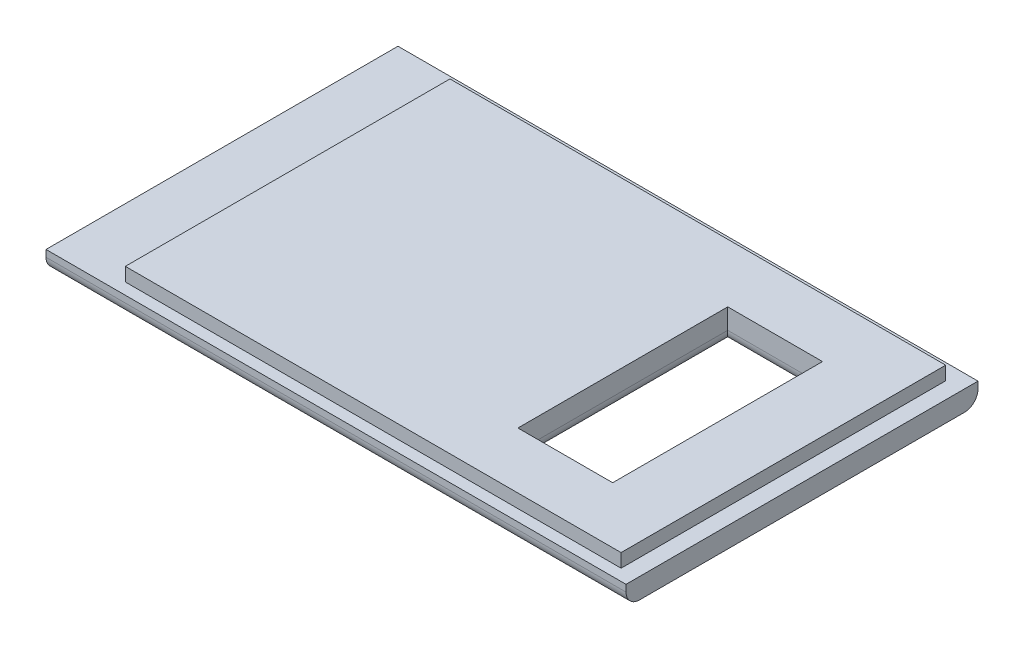
ISO-10303-21;
HEADER;
FILE_DESCRIPTION(('STEP AP214'),'2;1');
FILE_NAME('part.step','',(''),(''),'','','');
FILE_SCHEMA(('AUTOMOTIVE_DESIGN { 1 0 10303 214 1 1 1 1 }'));
ENDSEC;
DATA;
#1=APPLICATION_CONTEXT('core data for automotive mechanical design processes');
#2=APPLICATION_PROTOCOL_DEFINITION('international standard','automotive_design',2000,#1);
#3=PRODUCT_CONTEXT('',#1,'mechanical');
#4=PRODUCT('Part','Part','',(#3));
#5=PRODUCT_RELATED_PRODUCT_CATEGORY('part','',(#4));
#6=PRODUCT_DEFINITION_FORMATION('','',#4);
#7=PRODUCT_DEFINITION_CONTEXT('part definition',#1,'design');
#8=PRODUCT_DEFINITION('design','',#6,#7);
#9=PRODUCT_DEFINITION_SHAPE('','',#8);
#10=(LENGTH_UNIT() NAMED_UNIT(*) SI_UNIT(.MILLI.,.METRE.));
#11=(NAMED_UNIT(*) PLANE_ANGLE_UNIT() SI_UNIT($,.RADIAN.));
#12=(NAMED_UNIT(*) SI_UNIT($,.STERADIAN.) SOLID_ANGLE_UNIT());
#13=UNCERTAINTY_MEASURE_WITH_UNIT(LENGTH_MEASURE(1.E-05),#10,'distance_accuracy_value','');
#14=(GEOMETRIC_REPRESENTATION_CONTEXT(3) GLOBAL_UNCERTAINTY_ASSIGNED_CONTEXT((#13)) GLOBAL_UNIT_ASSIGNED_CONTEXT((#10,
#11,#12)) REPRESENTATION_CONTEXT('',''));
#15=CARTESIAN_POINT('',(0.,0.,0.));
#16=DIRECTION('',(0.,0.,1.));
#17=DIRECTION('',(1.,0.,0.));
#18=AXIS2_PLACEMENT_3D('',#15,#16,#17);
#19=CARTESIAN_POINT('',(0.,0.,0.));
#20=DIRECTION('',(0.,1.,0.));
#21=DIRECTION('',(0.,0.,1.));
#22=AXIS2_PLACEMENT_3D('',#19,#20,#21);
#23=PLANE('',#22);
#24=DIRECTION('',(0.,0.,1.));
#25=VECTOR('',#24,1.);
#26=CARTESIAN_POINT('',(53.6198539965798,0.,-32.2923627781718));
#27=LINE('',#26,#25);
#28=CARTESIAN_POINT('',(53.6198539965798,0.,9.61763722182825));
#29=VERTEX_POINT('',#28);
#30=CARTESIAN_POINT('',(53.6198539965798,0.,-34.8323627781718));
#31=VERTEX_POINT('',#30);
#32=EDGE_CURVE('E306',#29,#31,#27,.F.);
#33=ORIENTED_EDGE('',*,*,#32,.T.);
#34=DIRECTION('',(1.,0.,0.));
#35=VECTOR('',#34,1.);
#36=CARTESIAN_POINT('',(33.2998539965798,0.,-34.8323627781718));
#37=LINE('',#36,#35);
#38=CARTESIAN_POINT('',(30.7598539965798,0.,-34.8323627781718));
#39=VERTEX_POINT('',#38);
#40=EDGE_CURVE('E315',#31,#39,#37,.F.);
#41=ORIENTED_EDGE('',*,*,#40,.T.);
#42=DIRECTION('',(0.,0.,1.));
#43=VECTOR('',#42,1.);
#44=CARTESIAN_POINT('',(30.7598539965798,0.,0.));
#45=LINE('',#44,#43);
#46=CARTESIAN_POINT('',(30.7598539965798,0.,9.61763722182825));
#47=VERTEX_POINT('',#46);
#48=EDGE_CURVE('E312',#39,#47,#45,.T.);
#49=ORIENTED_EDGE('',*,*,#48,.T.);
#50=DIRECTION('',(1.,0.,0.));
#51=VECTOR('',#50,1.);
#52=CARTESIAN_POINT('',(0.,0.,9.61763722182825));
#53=LINE('',#52,#51);
#54=EDGE_CURVE('E309',#47,#29,#53,.T.);
#55=ORIENTED_EDGE('',*,*,#54,.T.);
#56=EDGE_LOOP('',(#33,#41,#49,#55));
#57=FACE_BOUND('',#56,.T.);
#58=DIRECTION('',(0.,0.,1.));
#59=VECTOR('',#58,1.);
#60=CARTESIAN_POINT('',(-42.5250491079234,0.,-46.2471717968124));
#61=LINE('',#60,#59);
#62=CARTESIAN_POINT('',(-42.5250491079234,0.,-43.7071717968124));
#63=VERTEX_POINT('',#62);
#64=CARTESIAN_POINT('',(-42.5250491079234,0.,17.2528282031876));
#65=VERTEX_POINT('',#64);
#66=EDGE_CURVE('E239',#63,#65,#61,.T.);
#67=ORIENTED_EDGE('',*,*,#66,.F.);
#68=DIRECTION('',(1.,0.,0.));
#69=VECTOR('',#68,1.);
#70=CARTESIAN_POINT('',(66.2990539113766,0.,-43.7071717968124));
#71=LINE('',#70,#69);
#72=CARTESIAN_POINT('',(66.2990539113766,0.,-43.7071717968124));
#73=VERTEX_POINT('',#72);
#74=EDGE_CURVE('E281',#63,#73,#71,.T.);
#75=ORIENTED_EDGE('',*,*,#74,.T.);
#76=DIRECTION('',(0.,0.,1.));
#77=VECTOR('',#76,1.);
#78=CARTESIAN_POINT('',(66.2990539113766,0.,-46.2471717968124));
#79=LINE('',#78,#77);
#80=CARTESIAN_POINT('',(66.2990539113766,0.,17.2528282031876));
#81=VERTEX_POINT('',#80);
#82=EDGE_CURVE('E245',#73,#81,#79,.T.);
#83=ORIENTED_EDGE('',*,*,#82,.T.);
#84=DIRECTION('',(1.,0.,0.));
#85=VECTOR('',#84,1.);
#86=CARTESIAN_POINT('',(0.,0.,17.2528282031876));
#87=LINE('',#86,#85);
#88=EDGE_CURVE('E278',#81,#65,#87,.F.);
#89=ORIENTED_EDGE('',*,*,#88,.T.);
#90=EDGE_LOOP('',(#67,#75,#83,#89));
#91=FACE_BOUND('',#90,.T.);
#92=ADVANCED_FACE('F38',(#57,#91),#23,.F.);
#93=CARTESIAN_POINT('',(0.,6.35,0.));
#94=DIRECTION('',(0.,1.,0.));
#95=DIRECTION('',(0.,0.,1.));
#96=AXIS2_PLACEMENT_3D('',#93,#94,#95);
#97=PLANE('',#96);
#98=DIRECTION('',(0.,0.,1.));
#99=VECTOR('',#98,1.);
#100=CARTESIAN_POINT('',(-29.7959261422426,6.35,-43.2705988826325));
#101=LINE('',#100,#99);
#102=CARTESIAN_POINT('',(-29.7959261422426,6.35,-43.2705988826325));
#103=VERTEX_POINT('',#102);
#104=CARTESIAN_POINT('',(-29.7959261422426,6.35,17.6386011173675));
#105=VERTEX_POINT('',#104);
#106=EDGE_CURVE('E195',#103,#105,#101,.T.);
#107=ORIENTED_EDGE('',*,*,#106,.T.);
#108=DIRECTION('',(1.,0.,0.));
#109=VECTOR('',#108,1.);
#110=CARTESIAN_POINT('',(-29.7959261422426,6.35,17.6386011173675));
#111=LINE('',#110,#109);
#112=CARTESIAN_POINT('',(63.2188738577574,6.35,17.6386011173675));
#113=VERTEX_POINT('',#112);
#114=EDGE_CURVE('E199',#105,#113,#111,.T.);
#115=ORIENTED_EDGE('',*,*,#114,.T.);
#116=DIRECTION('',(0.,0.,1.));
#117=VECTOR('',#116,1.);
#118=CARTESIAN_POINT('',(63.2188738577574,6.35,-43.2705988826325));
#119=LINE('',#118,#117);
#120=CARTESIAN_POINT('',(63.2188738577574,6.35,-43.2705988826325));
#121=VERTEX_POINT('',#120);
#122=EDGE_CURVE('E203',#121,#113,#119,.T.);
#123=ORIENTED_EDGE('',*,*,#122,.F.);
#124=DIRECTION('',(1.,0.,0.));
#125=VECTOR('',#124,1.);
#126=CARTESIAN_POINT('',(-29.7959261422426,6.35,-43.2705988826325));
#127=LINE('',#126,#125);
#128=EDGE_CURVE('E207',#103,#121,#127,.T.);
#129=ORIENTED_EDGE('',*,*,#128,.F.);
#130=EDGE_LOOP('',(#107,#115,#123,#129));
#131=FACE_BOUND('',#130,.T.);
#132=DIRECTION('',(0.,0.,1.));
#133=VECTOR('',#132,1.);
#134=CARTESIAN_POINT('',(33.2998539965798,6.35,-32.2923627781718));
#135=LINE('',#134,#133);
#136=CARTESIAN_POINT('',(33.2998539965798,6.35,-32.2923627781718));
#137=VERTEX_POINT('',#136);
#138=CARTESIAN_POINT('',(33.2998539965798,6.35,7.07763722182825));
#139=VERTEX_POINT('',#138);
#140=EDGE_CURVE('E176',#137,#139,#135,.T.);
#141=ORIENTED_EDGE('',*,*,#140,.F.);
#142=DIRECTION('',(1.,0.,0.));
#143=VECTOR('',#142,1.);
#144=CARTESIAN_POINT('',(33.2998539965798,6.35,-32.2923627781718));
#145=LINE('',#144,#143);
#146=CARTESIAN_POINT('',(51.0798539965798,6.35,-32.2923627781718));
#147=VERTEX_POINT('',#146);
#148=EDGE_CURVE('E157',#137,#147,#145,.T.);
#149=ORIENTED_EDGE('',*,*,#148,.T.);
#150=DIRECTION('',(0.,0.,1.));
#151=VECTOR('',#150,1.);
#152=CARTESIAN_POINT('',(51.0798539965798,6.35,-32.2923627781718));
#153=LINE('',#152,#151);
#154=CARTESIAN_POINT('',(51.0798539965798,6.35,7.07763722182825));
#155=VERTEX_POINT('',#154);
#156=EDGE_CURVE('E166',#147,#155,#153,.T.);
#157=ORIENTED_EDGE('',*,*,#156,.T.);
#158=DIRECTION('',(1.,0.,0.));
#159=VECTOR('',#158,1.);
#160=CARTESIAN_POINT('',(33.2998539965798,6.35,7.07763722182825));
#161=LINE('',#160,#159);
#162=EDGE_CURVE('E172',#139,#155,#161,.T.);
#163=ORIENTED_EDGE('',*,*,#162,.F.);
#164=EDGE_LOOP('',(#141,#149,#157,#163));
#165=FACE_BOUND('',#164,.T.);
#166=ADVANCED_FACE('F174',(#131,#165),#97,.T.);
#167=CARTESIAN_POINT('',(-42.5250491079234,3.81,-46.2471717968124));
#168=DIRECTION('',(1.,0.,0.));
#169=DIRECTION('',(0.,0.,-1.));
#170=AXIS2_PLACEMENT_3D('',#167,#168,#169);
#171=PLANE('',#170);
#172=DIRECTION('',(0.,-1.,0.));
#173=VECTOR('',#172,1.);
#174=CARTESIAN_POINT('',(-42.5250491079234,3.81,-46.2471717968124));
#175=LINE('',#174,#173);
#176=CARTESIAN_POINT('',(-42.5250491079234,3.81,-46.2471717968124));
#177=VERTEX_POINT('',#176);
#178=CARTESIAN_POINT('',(-42.5250491079234,2.54,-46.2471717968124));
#179=VERTEX_POINT('',#178);
#180=EDGE_CURVE('E256',#177,#179,#175,.T.);
#181=ORIENTED_EDGE('',*,*,#180,.T.);
#182=CARTESIAN_POINT('',(-42.5250491079234,2.54,-43.7071717968124));
#183=DIRECTION('',(1.,0.,0.));
#184=DIRECTION('',(0.,0.,-1.));
#185=AXIS2_PLACEMENT_3D('',#182,#183,#184);
#186=CIRCLE('',#185,2.54);
#187=EDGE_CURVE('E297',#179,#63,#186,.F.);
#188=ORIENTED_EDGE('',*,*,#187,.T.);
#189=ORIENTED_EDGE('',*,*,#66,.T.);
#190=CARTESIAN_POINT('',(-42.5250491079234,2.54,17.2528282031876));
#191=DIRECTION('',(1.,0.,0.));
#192=DIRECTION('',(0.,0.,-1.));
#193=AXIS2_PLACEMENT_3D('',#190,#191,#192);
#194=CIRCLE('',#193,2.54);
#195=CARTESIAN_POINT('',(-42.5250491079234,2.54,19.7928282031876));
#196=VERTEX_POINT('',#195);
#197=EDGE_CURVE('E294',#65,#196,#194,.F.);
#198=ORIENTED_EDGE('',*,*,#197,.T.);
#199=DIRECTION('',(0.,-1.,0.));
#200=VECTOR('',#199,1.);
#201=CARTESIAN_POINT('',(-42.5250491079234,3.81,19.7928282031876));
#202=LINE('',#201,#200);
#203=CARTESIAN_POINT('',(-42.5250491079234,3.81,19.7928282031876));
#204=VERTEX_POINT('',#203);
#205=EDGE_CURVE('E274',#204,#196,#202,.T.);
#206=ORIENTED_EDGE('',*,*,#205,.F.);
#207=DIRECTION('',(0.,0.,1.));
#208=VECTOR('',#207,1.);
#209=CARTESIAN_POINT('',(-42.5250491079234,3.81,-46.2471717968124));
#210=LINE('',#209,#208);
#211=EDGE_CURVE('E240',#177,#204,#210,.T.);
#212=ORIENTED_EDGE('',*,*,#211,.F.);
#213=EDGE_LOOP('',(#181,#188,#189,#198,#206,#212));
#214=FACE_BOUND('',#213,.T.);
#215=ADVANCED_FACE('F362',(#214),#171,.F.);
#216=CARTESIAN_POINT('',(-42.5250491079234,3.81,19.7928282031876));
#217=DIRECTION('',(0.,0.,-1.));
#218=DIRECTION('',(-1.,0.,0.));
#219=AXIS2_PLACEMENT_3D('',#216,#217,#218);
#220=PLANE('',#219);
#221=ORIENTED_EDGE('',*,*,#205,.T.);
#222=DIRECTION('',(1.,0.,0.));
#223=VECTOR('',#222,1.);
#224=CARTESIAN_POINT('',(-42.5250491079234,2.54,19.7928282031876));
#225=LINE('',#224,#223);
#226=CARTESIAN_POINT('',(66.2990539113766,2.54,19.7928282031876));
#227=VERTEX_POINT('',#226);
#228=EDGE_CURVE('E300',#196,#227,#225,.T.);
#229=ORIENTED_EDGE('',*,*,#228,.T.);
#230=DIRECTION('',(0.,-1.,0.));
#231=VECTOR('',#230,1.);
#232=CARTESIAN_POINT('',(66.2990539113766,3.81,19.7928282031876));
#233=LINE('',#232,#231);
#234=CARTESIAN_POINT('',(66.2990539113766,3.81,19.7928282031876));
#235=VERTEX_POINT('',#234);
#236=EDGE_CURVE('E270',#235,#227,#233,.T.);
#237=ORIENTED_EDGE('',*,*,#236,.F.);
#238=DIRECTION('',(1.,0.,0.));
#239=VECTOR('',#238,1.);
#240=CARTESIAN_POINT('',(-42.5250491079234,3.81,19.7928282031876));
#241=LINE('',#240,#239);
#242=EDGE_CURVE('E244',#204,#235,#241,.T.);
#243=ORIENTED_EDGE('',*,*,#242,.F.);
#244=EDGE_LOOP('',(#221,#229,#237,#243));
#245=FACE_BOUND('',#244,.T.);
#246=ADVANCED_FACE('F377',(#245),#220,.F.);
#247=CARTESIAN_POINT('',(66.2990539113766,3.81,-46.2471717968124));
#248=DIRECTION('',(1.,0.,0.));
#249=DIRECTION('',(0.,0.,-1.));
#250=AXIS2_PLACEMENT_3D('',#247,#248,#249);
#251=PLANE('',#250);
#252=ORIENTED_EDGE('',*,*,#82,.F.);
#253=CARTESIAN_POINT('',(66.2990539113766,2.54,-43.7071717968124));
#254=DIRECTION('',(1.,0.,0.));
#255=DIRECTION('',(0.,0.,-1.));
#256=AXIS2_PLACEMENT_3D('',#253,#254,#255);
#257=CIRCLE('',#256,2.54);
#258=CARTESIAN_POINT('',(66.2990539113766,2.54,-46.2471717968124));
#259=VERTEX_POINT('',#258);
#260=EDGE_CURVE('E288',#73,#259,#257,.T.);
#261=ORIENTED_EDGE('',*,*,#260,.T.);
#262=DIRECTION('',(0.,-1.,0.));
#263=VECTOR('',#262,1.);
#264=CARTESIAN_POINT('',(66.2990539113766,3.81,-46.2471717968124));
#265=LINE('',#264,#263);
#266=CARTESIAN_POINT('',(66.2990539113766,3.81,-46.2471717968124));
#267=VERTEX_POINT('',#266);
#268=EDGE_CURVE('E266',#267,#259,#265,.T.);
#269=ORIENTED_EDGE('',*,*,#268,.F.);
#270=DIRECTION('',(0.,0.,1.));
#271=VECTOR('',#270,1.);
#272=CARTESIAN_POINT('',(66.2990539113766,3.81,-46.2471717968124));
#273=LINE('',#272,#271);
#274=EDGE_CURVE('E248',#267,#235,#273,.T.);
#275=ORIENTED_EDGE('',*,*,#274,.T.);
#276=ORIENTED_EDGE('',*,*,#236,.T.);
#277=CARTESIAN_POINT('',(66.2990539113766,2.54,17.2528282031876));
#278=DIRECTION('',(1.,0.,0.));
#279=DIRECTION('',(0.,0.,-1.));
#280=AXIS2_PLACEMENT_3D('',#277,#278,#279);
#281=CIRCLE('',#280,2.54);
#282=EDGE_CURVE('E285',#227,#81,#281,.T.);
#283=ORIENTED_EDGE('',*,*,#282,.T.);
#284=EDGE_LOOP('',(#252,#261,#269,#275,#276,#283));
#285=FACE_BOUND('',#284,.T.);
#286=ADVANCED_FACE('F373',(#285),#251,.T.);
#287=CARTESIAN_POINT('',(-42.5250491079234,3.81,-46.2471717968124));
#288=DIRECTION('',(0.,0.,-1.));
#289=DIRECTION('',(-1.,0.,0.));
#290=AXIS2_PLACEMENT_3D('',#287,#288,#289);
#291=PLANE('',#290);
#292=ORIENTED_EDGE('',*,*,#268,.T.);
#293=DIRECTION('',(1.,0.,0.));
#294=VECTOR('',#293,1.);
#295=CARTESIAN_POINT('',(-42.5250491079234,2.54,-46.2471717968124));
#296=LINE('',#295,#294);
#297=EDGE_CURVE('E291',#259,#179,#296,.F.);
#298=ORIENTED_EDGE('',*,*,#297,.T.);
#299=ORIENTED_EDGE('',*,*,#180,.F.);
#300=DIRECTION('',(1.,0.,0.));
#301=VECTOR('',#300,1.);
#302=CARTESIAN_POINT('',(-42.5250491079234,3.81,-46.2471717968124));
#303=LINE('',#302,#301);
#304=EDGE_CURVE('E252',#177,#267,#303,.T.);
#305=ORIENTED_EDGE('',*,*,#304,.T.);
#306=EDGE_LOOP('',(#292,#298,#299,#305));
#307=FACE_BOUND('',#306,.T.);
#308=ADVANCED_FACE('F370',(#307),#291,.T.);
#309=CARTESIAN_POINT('',(0.,3.81,0.));
#310=DIRECTION('',(0.,1.,0.));
#311=DIRECTION('',(0.,0.,1.));
#312=AXIS2_PLACEMENT_3D('',#309,#310,#311);
#313=PLANE('',#312);
#314=DIRECTION('',(0.,0.,1.));
#315=VECTOR('',#314,1.);
#316=CARTESIAN_POINT('',(-29.7959261422426,3.81,-43.2705988826325));
#317=LINE('',#316,#315);
#318=CARTESIAN_POINT('',(-29.7959261422426,3.81,-43.2705988826325));
#319=VERTEX_POINT('',#318);
#320=CARTESIAN_POINT('',(-29.7959261422426,3.81,17.6386011173675));
#321=VERTEX_POINT('',#320);
#322=EDGE_CURVE('E162',#319,#321,#317,.T.);
#323=ORIENTED_EDGE('',*,*,#322,.F.);
#324=DIRECTION('',(1.,0.,0.));
#325=VECTOR('',#324,1.);
#326=CARTESIAN_POINT('',(-29.7959261422426,3.81,-43.2705988826325));
#327=LINE('',#326,#325);
#328=CARTESIAN_POINT('',(63.2188738577574,3.81,-43.2705988826325));
#329=VERTEX_POINT('',#328);
#330=EDGE_CURVE('E200',#319,#329,#327,.T.);
#331=ORIENTED_EDGE('',*,*,#330,.T.);
#332=DIRECTION('',(0.,0.,1.));
#333=VECTOR('',#332,1.);
#334=CARTESIAN_POINT('',(63.2188738577574,3.81,-43.2705988826325));
#335=LINE('',#334,#333);
#336=CARTESIAN_POINT('',(63.2188738577574,3.81,17.6386011173675));
#337=VERTEX_POINT('',#336);
#338=EDGE_CURVE('E219',#329,#337,#335,.T.);
#339=ORIENTED_EDGE('',*,*,#338,.T.);
#340=DIRECTION('',(1.,0.,0.));
#341=VECTOR('',#340,1.);
#342=CARTESIAN_POINT('',(-29.7959261422426,3.81,17.6386011173675));
#343=LINE('',#342,#341);
#344=EDGE_CURVE('E215',#321,#337,#343,.T.);
#345=ORIENTED_EDGE('',*,*,#344,.F.);
#346=EDGE_LOOP('',(#323,#331,#339,#345));
#347=FACE_BOUND('',#346,.T.);
#348=ORIENTED_EDGE('',*,*,#211,.T.);
#349=ORIENTED_EDGE('',*,*,#242,.T.);
#350=ORIENTED_EDGE('',*,*,#274,.F.);
#351=ORIENTED_EDGE('',*,*,#304,.F.);
#352=EDGE_LOOP('',(#348,#349,#350,#351));
#353=FACE_BOUND('',#352,.T.);
#354=ADVANCED_FACE('F368',(#347,#353),#313,.T.);
#355=CARTESIAN_POINT('',(-29.7959261422426,6.35,-43.2705988826325));
#356=DIRECTION('',(1.,0.,0.));
#357=DIRECTION('',(0.,0.,-1.));
#358=AXIS2_PLACEMENT_3D('',#355,#356,#357);
#359=PLANE('',#358);
#360=ORIENTED_EDGE('',*,*,#322,.T.);
#361=DIRECTION('',(0.,-1.,0.));
#362=VECTOR('',#361,1.);
#363=CARTESIAN_POINT('',(-29.7959261422426,6.35,17.6386011173675));
#364=LINE('',#363,#362);
#365=EDGE_CURVE('E235',#105,#321,#364,.T.);
#366=ORIENTED_EDGE('',*,*,#365,.F.);
#367=ORIENTED_EDGE('',*,*,#106,.F.);
#368=DIRECTION('',(0.,-1.,0.));
#369=VECTOR('',#368,1.);
#370=CARTESIAN_POINT('',(-29.7959261422426,6.35,-43.2705988826325));
#371=LINE('',#370,#369);
#372=EDGE_CURVE('E211',#103,#319,#371,.T.);
#373=ORIENTED_EDGE('',*,*,#372,.T.);
#374=EDGE_LOOP('',(#360,#366,#367,#373));
#375=FACE_BOUND('',#374,.T.);
#376=ADVANCED_FACE('F467',(#375),#359,.F.);
#377=CARTESIAN_POINT('',(-29.7959261422426,6.35,17.6386011173675));
#378=DIRECTION('',(0.,0.,-1.));
#379=DIRECTION('',(-1.,0.,0.));
#380=AXIS2_PLACEMENT_3D('',#377,#378,#379);
#381=PLANE('',#380);
#382=ORIENTED_EDGE('',*,*,#344,.T.);
#383=DIRECTION('',(0.,-1.,0.));
#384=VECTOR('',#383,1.);
#385=CARTESIAN_POINT('',(63.2188738577574,6.35,17.6386011173675));
#386=LINE('',#385,#384);
#387=EDGE_CURVE('E231',#113,#337,#386,.T.);
#388=ORIENTED_EDGE('',*,*,#387,.F.);
#389=ORIENTED_EDGE('',*,*,#114,.F.);
#390=ORIENTED_EDGE('',*,*,#365,.T.);
#391=EDGE_LOOP('',(#382,#388,#389,#390));
#392=FACE_BOUND('',#391,.T.);
#393=ADVANCED_FACE('F459',(#392),#381,.F.);
#394=CARTESIAN_POINT('',(63.2188738577574,6.35,-43.2705988826325));
#395=DIRECTION('',(1.,0.,0.));
#396=DIRECTION('',(0.,0.,-1.));
#397=AXIS2_PLACEMENT_3D('',#394,#395,#396);
#398=PLANE('',#397);
#399=ORIENTED_EDGE('',*,*,#338,.F.);
#400=DIRECTION('',(0.,-1.,0.));
#401=VECTOR('',#400,1.);
#402=CARTESIAN_POINT('',(63.2188738577574,6.35,-43.2705988826325));
#403=LINE('',#402,#401);
#404=EDGE_CURVE('E227',#121,#329,#403,.T.);
#405=ORIENTED_EDGE('',*,*,#404,.F.);
#406=ORIENTED_EDGE('',*,*,#122,.T.);
#407=ORIENTED_EDGE('',*,*,#387,.T.);
#408=EDGE_LOOP('',(#399,#405,#406,#407));
#409=FACE_BOUND('',#408,.T.);
#410=ADVANCED_FACE('F451',(#409),#398,.T.);
#411=CARTESIAN_POINT('',(-29.7959261422426,6.35,-43.2705988826325));
#412=DIRECTION('',(0.,0.,-1.));
#413=DIRECTION('',(-1.,0.,0.));
#414=AXIS2_PLACEMENT_3D('',#411,#412,#413);
#415=PLANE('',#414);
#416=ORIENTED_EDGE('',*,*,#330,.F.);
#417=ORIENTED_EDGE('',*,*,#372,.F.);
#418=ORIENTED_EDGE('',*,*,#128,.T.);
#419=ORIENTED_EDGE('',*,*,#404,.T.);
#420=EDGE_LOOP('',(#416,#417,#418,#419));
#421=FACE_BOUND('',#420,.T.);
#422=ADVANCED_FACE('F389',(#421),#415,.T.);
#423=CARTESIAN_POINT('',(0.,2.54,-43.7071717968124));
#424=DIRECTION('',(-1.,0.,0.));
#425=DIRECTION('',(0.,0.,1.));
#426=AXIS2_PLACEMENT_3D('',#423,#424,#425);
#427=CYLINDRICAL_SURFACE('',#426,2.54);
#428=ORIENTED_EDGE('',*,*,#187,.F.);
#429=ORIENTED_EDGE('',*,*,#297,.F.);
#430=ORIENTED_EDGE('',*,*,#260,.F.);
#431=ORIENTED_EDGE('',*,*,#74,.F.);
#432=EDGE_LOOP('',(#428,#429,#430,#431));
#433=FACE_BOUND('',#432,.T.);
#434=ADVANCED_FACE('F385',(#433),#427,.T.);
#435=CARTESIAN_POINT('',(-42.5250491079234,2.54,17.2528282031876));
#436=DIRECTION('',(1.,0.,0.));
#437=DIRECTION('',(0.,0.,-1.));
#438=AXIS2_PLACEMENT_3D('',#435,#436,#437);
#439=CYLINDRICAL_SURFACE('',#438,2.54);
#440=ORIENTED_EDGE('',*,*,#197,.F.);
#441=ORIENTED_EDGE('',*,*,#88,.F.);
#442=ORIENTED_EDGE('',*,*,#282,.F.);
#443=ORIENTED_EDGE('',*,*,#228,.F.);
#444=EDGE_LOOP('',(#440,#441,#442,#443));
#445=FACE_BOUND('',#444,.T.);
#446=ADVANCED_FACE('F388',(#445),#439,.T.);
#447=CARTESIAN_POINT('',(33.2998539965798,-1.016,-32.2923627781718));
#448=DIRECTION('',(0.,0.,1.));
#449=DIRECTION('',(1.,0.,0.));
#450=AXIS2_PLACEMENT_3D('',#447,#448,#449);
#451=PLANE('',#450);
#452=DIRECTION('',(0.,1.,0.));
#453=VECTOR('',#452,1.);
#454=CARTESIAN_POINT('',(33.2998539965798,-1.016,-32.2923627781718));
#455=LINE('',#454,#453);
#456=CARTESIAN_POINT('',(33.2998539965798,2.54,-32.2923627781718));
#457=VERTEX_POINT('',#456);
#458=EDGE_CURVE('E187',#457,#137,#455,.T.);
#459=ORIENTED_EDGE('',*,*,#458,.F.);
#460=DIRECTION('',(1.,0.,0.));
#461=VECTOR('',#460,1.);
#462=CARTESIAN_POINT('',(51.0798539965798,2.54,-32.2923627781718));
#463=LINE('',#462,#461);
#464=CARTESIAN_POINT('',(51.0798539965798,2.54,-32.2923627781718));
#465=VERTEX_POINT('',#464);
#466=EDGE_CURVE('E160',#457,#465,#463,.T.);
#467=ORIENTED_EDGE('',*,*,#466,.T.);
#468=DIRECTION('',(0.,1.,0.));
#469=VECTOR('',#468,1.);
#470=CARTESIAN_POINT('',(51.0798539965798,-1.016,-32.2923627781718));
#471=LINE('',#470,#469);
#472=EDGE_CURVE('E152',#465,#147,#471,.T.);
#473=ORIENTED_EDGE('',*,*,#472,.T.);
#474=ORIENTED_EDGE('',*,*,#148,.F.);
#475=EDGE_LOOP('',(#459,#467,#473,#474));
#476=FACE_BOUND('',#475,.T.);
#477=ADVANCED_FACE('F155',(#476),#451,.T.);
#478=CARTESIAN_POINT('',(51.0798539965798,-1.016,-32.2923627781718));
#479=DIRECTION('',(-1.,0.,0.));
#480=DIRECTION('',(0.,0.,1.));
#481=AXIS2_PLACEMENT_3D('',#478,#479,#480);
#482=PLANE('',#481);
#483=ORIENTED_EDGE('',*,*,#472,.F.);
#484=DIRECTION('',(0.,0.,1.));
#485=VECTOR('',#484,1.);
#486=CARTESIAN_POINT('',(51.0798539965798,2.54,7.07763722182825));
#487=LINE('',#486,#485);
#488=CARTESIAN_POINT('',(51.0798539965798,2.54,7.07763722182825));
#489=VERTEX_POINT('',#488);
#490=EDGE_CURVE('E11',#465,#489,#487,.T.);
#491=ORIENTED_EDGE('',*,*,#490,.T.);
#492=DIRECTION('',(0.,1.,0.));
#493=VECTOR('',#492,1.);
#494=CARTESIAN_POINT('',(51.0798539965798,-1.016,7.07763722182825));
#495=LINE('',#494,#493);
#496=EDGE_CURVE('E163',#489,#155,#495,.T.);
#497=ORIENTED_EDGE('',*,*,#496,.T.);
#498=ORIENTED_EDGE('',*,*,#156,.F.);
#499=EDGE_LOOP('',(#483,#491,#497,#498));
#500=FACE_BOUND('',#499,.T.);
#501=ADVANCED_FACE('F167',(#500),#482,.T.);
#502=CARTESIAN_POINT('',(33.2998539965798,-1.016,7.07763722182825));
#503=DIRECTION('',(0.,0.,1.));
#504=DIRECTION('',(1.,0.,0.));
#505=AXIS2_PLACEMENT_3D('',#502,#503,#504);
#506=PLANE('',#505);
#507=ORIENTED_EDGE('',*,*,#496,.F.);
#508=DIRECTION('',(1.,0.,0.));
#509=VECTOR('',#508,1.);
#510=CARTESIAN_POINT('',(33.2998539965798,2.54,7.07763722182825));
#511=LINE('',#510,#509);
#512=CARTESIAN_POINT('',(33.2998539965798,2.54,7.07763722182825));
#513=VERTEX_POINT('',#512);
#514=EDGE_CURVE('E48',#489,#513,#511,.F.);
#515=ORIENTED_EDGE('',*,*,#514,.T.);
#516=DIRECTION('',(0.,1.,0.));
#517=VECTOR('',#516,1.);
#518=CARTESIAN_POINT('',(33.2998539965798,-1.016,7.07763722182825));
#519=LINE('',#518,#517);
#520=EDGE_CURVE('E190',#513,#139,#519,.T.);
#521=ORIENTED_EDGE('',*,*,#520,.T.);
#522=ORIENTED_EDGE('',*,*,#162,.T.);
#523=EDGE_LOOP('',(#507,#515,#521,#522));
#524=FACE_BOUND('',#523,.T.);
#525=ADVANCED_FACE('F346',(#524),#506,.F.);
#526=CARTESIAN_POINT('',(33.2998539965798,-1.016,-32.2923627781718));
#527=DIRECTION('',(-1.,0.,0.));
#528=DIRECTION('',(0.,0.,1.));
#529=AXIS2_PLACEMENT_3D('',#526,#527,#528);
#530=PLANE('',#529);
#531=ORIENTED_EDGE('',*,*,#520,.F.);
#532=DIRECTION('',(0.,0.,1.));
#533=VECTOR('',#532,1.);
#534=CARTESIAN_POINT('',(33.2998539965798,2.54,-32.2923627781718));
#535=LINE('',#534,#533);
#536=EDGE_CURVE('E319',#513,#457,#535,.F.);
#537=ORIENTED_EDGE('',*,*,#536,.T.);
#538=ORIENTED_EDGE('',*,*,#458,.T.);
#539=ORIENTED_EDGE('',*,*,#140,.T.);
#540=EDGE_LOOP('',(#531,#537,#538,#539));
#541=FACE_BOUND('',#540,.T.);
#542=ADVANCED_FACE('F345',(#541),#530,.F.);
#543=CARTESIAN_POINT('',(0.,2.54,9.61763722182825));
#544=DIRECTION('',(1.,0.,0.));
#545=DIRECTION('',(0.,0.,-1.));
#546=AXIS2_PLACEMENT_3D('',#543,#544,#545);
#547=CYLINDRICAL_SURFACE('',#546,2.54);
#548=CARTESIAN_POINT('',(53.6198539965798,2.54,9.61763722182825));
#549=DIRECTION('',(0.707106781186547,0.,-0.707106781186547));
#550=DIRECTION('',(0.707106781186547,0.,0.707106781186547));
#551=AXIS2_PLACEMENT_3D('',#548,#549,#550);
#552=ELLIPSE('',#551,3.59210244842766,2.54);
#553=EDGE_CURVE('E181',#29,#489,#552,.T.);
#554=ORIENTED_EDGE('',*,*,#553,.F.);
#555=ORIENTED_EDGE('',*,*,#54,.F.);
#556=CARTESIAN_POINT('',(30.7598539965798,2.54,9.61763722182825));
#557=DIRECTION('',(0.707106781186548,0.,0.707106781186547));
#558=DIRECTION('',(-0.707106781186547,0.,0.707106781186548));
#559=AXIS2_PLACEMENT_3D('',#556,#557,#558);
#560=ELLIPSE('',#559,3.59210244842766,2.54);
#561=EDGE_CURVE('E42',#513,#47,#560,.F.);
#562=ORIENTED_EDGE('',*,*,#561,.F.);
#563=ORIENTED_EDGE('',*,*,#514,.F.);
#564=EDGE_LOOP('',(#554,#555,#562,#563));
#565=FACE_BOUND('',#564,.T.);
#566=ADVANCED_FACE('F40',(#565),#547,.T.);
#567=CARTESIAN_POINT('',(30.7598539965798,2.54,0.));
#568=DIRECTION('',(0.,0.,1.));
#569=DIRECTION('',(1.,0.,0.));
#570=AXIS2_PLACEMENT_3D('',#567,#568,#569);
#571=CYLINDRICAL_SURFACE('',#570,2.54);
#572=ORIENTED_EDGE('',*,*,#561,.T.);
#573=ORIENTED_EDGE('',*,*,#48,.F.);
#574=CARTESIAN_POINT('',(30.7598539965798,2.54,-34.8323627781718));
#575=DIRECTION('',(-0.707106781186547,0.,0.707106781186548));
#576=DIRECTION('',(-0.707106781186548,0.,-0.707106781186547));
#577=AXIS2_PLACEMENT_3D('',#574,#575,#576);
#578=ELLIPSE('',#577,3.59210244842766,2.54);
#579=EDGE_CURVE('E327',#457,#39,#578,.F.);
#580=ORIENTED_EDGE('',*,*,#579,.F.);
#581=ORIENTED_EDGE('',*,*,#536,.F.);
#582=EDGE_LOOP('',(#572,#573,#580,#581));
#583=FACE_BOUND('',#582,.T.);
#584=ADVANCED_FACE('F343',(#583),#571,.T.);
#585=CARTESIAN_POINT('',(53.6198539965798,2.54,-32.2923627781718));
#586=DIRECTION('',(0.,0.,-1.));
#587=DIRECTION('',(-1.,0.,0.));
#588=AXIS2_PLACEMENT_3D('',#585,#586,#587);
#589=CYLINDRICAL_SURFACE('',#588,2.54);
#590=ORIENTED_EDGE('',*,*,#553,.T.);
#591=ORIENTED_EDGE('',*,*,#490,.F.);
#592=CARTESIAN_POINT('',(53.6198539965798,2.54,-34.8323627781718));
#593=DIRECTION('',(-0.707106781186547,0.,-0.707106781186547));
#594=DIRECTION('',(-0.707106781186547,0.,0.707106781186547));
#595=AXIS2_PLACEMENT_3D('',#592,#593,#594);
#596=ELLIPSE('',#595,3.59210244842766,2.54);
#597=EDGE_CURVE('E324',#31,#465,#596,.T.);
#598=ORIENTED_EDGE('',*,*,#597,.F.);
#599=ORIENTED_EDGE('',*,*,#32,.F.);
#600=EDGE_LOOP('',(#590,#591,#598,#599));
#601=FACE_BOUND('',#600,.T.);
#602=ADVANCED_FACE('F334',(#601),#589,.T.);
#603=CARTESIAN_POINT('',(33.2998539965798,2.54,-34.8323627781718));
#604=DIRECTION('',(-1.,0.,0.));
#605=DIRECTION('',(0.,0.,1.));
#606=AXIS2_PLACEMENT_3D('',#603,#604,#605);
#607=CYLINDRICAL_SURFACE('',#606,2.54);
#608=ORIENTED_EDGE('',*,*,#579,.T.);
#609=ORIENTED_EDGE('',*,*,#40,.F.);
#610=ORIENTED_EDGE('',*,*,#597,.T.);
#611=ORIENTED_EDGE('',*,*,#466,.F.);
#612=EDGE_LOOP('',(#608,#609,#610,#611));
#613=FACE_BOUND('',#612,.T.);
#614=ADVANCED_FACE('F394',(#613),#607,.T.);
#615=CLOSED_SHELL('',(#92,#166,#215,#246,#286,#308,#354,#376,#393,#410,#422,#434,#446,#477,#501,
#525,#542,#566,#584,#602,#614));
#616=MANIFOLD_SOLID_BREP('B2',#615);
#617=ADVANCED_BREP_SHAPE_REPRESENTATION('',(#18,#616),#14);
#618=SHAPE_DEFINITION_REPRESENTATION(#9,#617);
ENDSEC;
END-ISO-10303-21;
